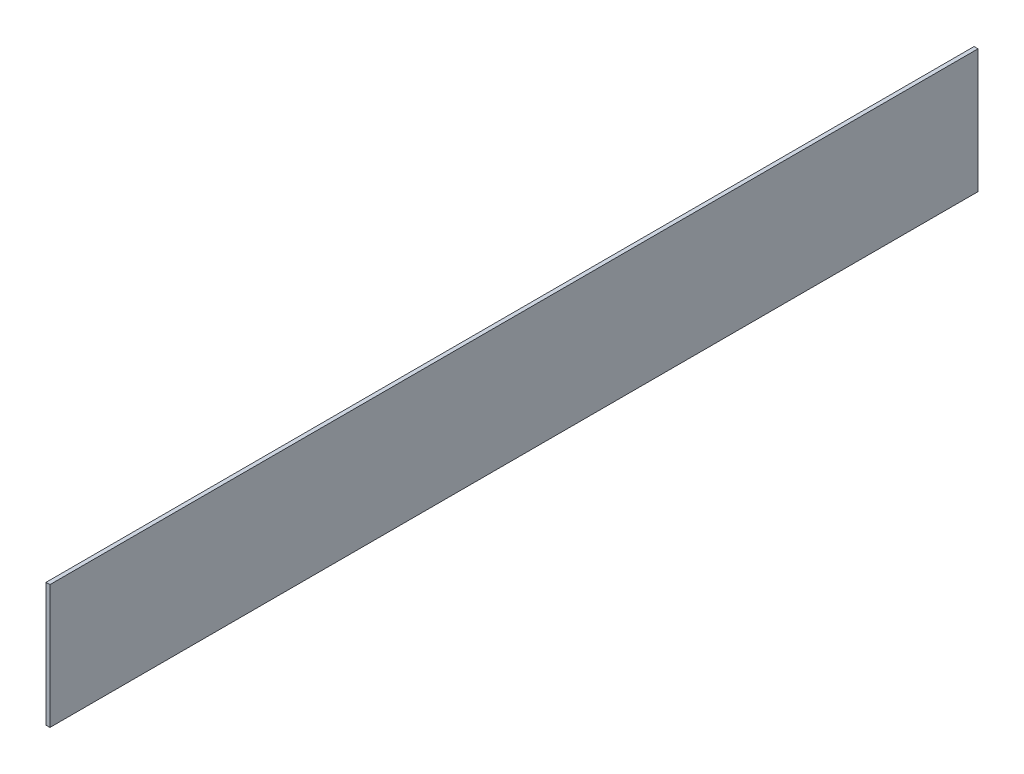
ISO-10303-21;
HEADER;
FILE_DESCRIPTION(('STEP AP214'),'2;1');
FILE_NAME('part.step','',(''),(''),'','','');
FILE_SCHEMA(('AUTOMOTIVE_DESIGN { 1 0 10303 214 1 1 1 1 }'));
ENDSEC;
DATA;
#1=APPLICATION_CONTEXT('core data for automotive mechanical design processes');
#2=APPLICATION_PROTOCOL_DEFINITION('international standard','automotive_design',2000,#1);
#3=PRODUCT_CONTEXT('',#1,'mechanical');
#4=PRODUCT('Part','Part','',(#3));
#5=PRODUCT_RELATED_PRODUCT_CATEGORY('part','',(#4));
#6=PRODUCT_DEFINITION_FORMATION('','',#4);
#7=PRODUCT_DEFINITION_CONTEXT('part definition',#1,'design');
#8=PRODUCT_DEFINITION('design','',#6,#7);
#9=PRODUCT_DEFINITION_SHAPE('','',#8);
#10=(LENGTH_UNIT() NAMED_UNIT(*) SI_UNIT(.MILLI.,.METRE.));
#11=(NAMED_UNIT(*) PLANE_ANGLE_UNIT() SI_UNIT($,.RADIAN.));
#12=(NAMED_UNIT(*) SI_UNIT($,.STERADIAN.) SOLID_ANGLE_UNIT());
#13=UNCERTAINTY_MEASURE_WITH_UNIT(LENGTH_MEASURE(1.E-05),#10,'distance_accuracy_value','');
#14=(GEOMETRIC_REPRESENTATION_CONTEXT(3) GLOBAL_UNCERTAINTY_ASSIGNED_CONTEXT((#13)) GLOBAL_UNIT_ASSIGNED_CONTEXT((#10,
#11,#12)) REPRESENTATION_CONTEXT('',''));
#15=CARTESIAN_POINT('',(0.,0.,0.));
#16=DIRECTION('',(0.,0.,1.));
#17=DIRECTION('',(1.,0.,0.));
#18=AXIS2_PLACEMENT_3D('',#15,#16,#17);
#19=CARTESIAN_POINT('',(3.175,100.,750.));
#20=DIRECTION('',(0.,0.,-1.));
#21=DIRECTION('',(-1.,0.,0.));
#22=AXIS2_PLACEMENT_3D('',#19,#20,#21);
#23=PLANE('',#22);
#24=DIRECTION('',(0.,-1.,0.));
#25=VECTOR('',#24,1.);
#26=CARTESIAN_POINT('',(-3.175,100.,750.));
#27=LINE('',#26,#25);
#28=CARTESIAN_POINT('',(-3.175,100.,750.));
#29=VERTEX_POINT('',#28);
#30=CARTESIAN_POINT('',(-3.175,-100.,750.));
#31=VERTEX_POINT('',#30);
#32=EDGE_CURVE('E96',#29,#31,#27,.T.);
#33=ORIENTED_EDGE('',*,*,#32,.T.);
#34=DIRECTION('',(-1.,0.,0.));
#35=VECTOR('',#34,1.);
#36=CARTESIAN_POINT('',(3.175,-100.,750.));
#37=LINE('',#36,#35);
#38=CARTESIAN_POINT('',(3.175,-100.,750.));
#39=VERTEX_POINT('',#38);
#40=EDGE_CURVE('E11',#39,#31,#37,.T.);
#41=ORIENTED_EDGE('',*,*,#40,.F.);
#42=DIRECTION('',(0.,-1.,0.));
#43=VECTOR('',#42,1.);
#44=CARTESIAN_POINT('',(3.175,100.,750.));
#45=LINE('',#44,#43);
#46=CARTESIAN_POINT('',(3.175,100.,750.));
#47=VERTEX_POINT('',#46);
#48=EDGE_CURVE('E84',#47,#39,#45,.T.);
#49=ORIENTED_EDGE('',*,*,#48,.F.);
#50=DIRECTION('',(-1.,0.,0.));
#51=VECTOR('',#50,1.);
#52=CARTESIAN_POINT('',(3.175,100.,750.));
#53=LINE('',#52,#51);
#54=EDGE_CURVE('E92',#47,#29,#53,.T.);
#55=ORIENTED_EDGE('',*,*,#54,.T.);
#56=EDGE_LOOP('',(#33,#41,#49,#55));
#57=FACE_BOUND('',#56,.T.);
#58=ADVANCED_FACE('F33',(#57),#23,.F.);
#59=CARTESIAN_POINT('',(3.175,-99.9999999999999,-750.));
#60=DIRECTION('',(0.,1.,0.));
#61=DIRECTION('',(0.,0.,1.));
#62=AXIS2_PLACEMENT_3D('',#59,#60,#61);
#63=PLANE('',#62);
#64=DIRECTION('',(0.,0.,-1.));
#65=VECTOR('',#64,1.);
#66=CARTESIAN_POINT('',(-3.175,-99.9999999999999,-750.));
#67=LINE('',#66,#65);
#68=CARTESIAN_POINT('',(-3.175,-99.9999999999999,-750.));
#69=VERTEX_POINT('',#68);
#70=EDGE_CURVE('E88',#31,#69,#67,.T.);
#71=ORIENTED_EDGE('',*,*,#70,.T.);
#72=DIRECTION('',(-1.,0.,0.));
#73=VECTOR('',#72,1.);
#74=CARTESIAN_POINT('',(3.175,-99.9999999999999,-750.));
#75=LINE('',#74,#73);
#76=CARTESIAN_POINT('',(3.175,-99.9999999999999,-750.));
#77=VERTEX_POINT('',#76);
#78=EDGE_CURVE('E41',#77,#69,#75,.T.);
#79=ORIENTED_EDGE('',*,*,#78,.F.);
#80=DIRECTION('',(0.,0.,-1.));
#81=VECTOR('',#80,1.);
#82=CARTESIAN_POINT('',(3.175,-99.9999999999999,-750.));
#83=LINE('',#82,#81);
#84=EDGE_CURVE('E79',#39,#77,#83,.T.);
#85=ORIENTED_EDGE('',*,*,#84,.F.);
#86=ORIENTED_EDGE('',*,*,#40,.T.);
#87=EDGE_LOOP('',(#71,#79,#85,#86));
#88=FACE_BOUND('',#87,.T.);
#89=ADVANCED_FACE('F87',(#88),#63,.F.);
#90=CARTESIAN_POINT('',(3.175,100.,-750.));
#91=DIRECTION('',(0.,0.,1.));
#92=DIRECTION('',(1.,0.,0.));
#93=AXIS2_PLACEMENT_3D('',#90,#91,#92);
#94=PLANE('',#93);
#95=DIRECTION('',(0.,1.,0.));
#96=VECTOR('',#95,1.);
#97=CARTESIAN_POINT('',(-3.175,100.,-750.));
#98=LINE('',#97,#96);
#99=CARTESIAN_POINT('',(-3.175,100.,-750.));
#100=VERTEX_POINT('',#99);
#101=EDGE_CURVE('E66',#69,#100,#98,.T.);
#102=ORIENTED_EDGE('',*,*,#101,.T.);
#103=DIRECTION('',(-1.,0.,0.));
#104=VECTOR('',#103,1.);
#105=CARTESIAN_POINT('',(3.175,100.,-750.));
#106=LINE('',#105,#104);
#107=CARTESIAN_POINT('',(3.175,100.,-750.));
#108=VERTEX_POINT('',#107);
#109=EDGE_CURVE('E89',#108,#100,#106,.T.);
#110=ORIENTED_EDGE('',*,*,#109,.F.);
#111=DIRECTION('',(0.,1.,0.));
#112=VECTOR('',#111,1.);
#113=CARTESIAN_POINT('',(3.175,100.,-750.));
#114=LINE('',#113,#112);
#115=EDGE_CURVE('E82',#77,#108,#114,.T.);
#116=ORIENTED_EDGE('',*,*,#115,.F.);
#117=ORIENTED_EDGE('',*,*,#78,.T.);
#118=EDGE_LOOP('',(#102,#110,#116,#117));
#119=FACE_BOUND('',#118,.T.);
#120=ADVANCED_FACE('F90',(#119),#94,.F.);
#121=CARTESIAN_POINT('',(3.175,100.,-750.));
#122=DIRECTION('',(0.,-1.,0.));
#123=DIRECTION('',(0.,0.,-1.));
#124=AXIS2_PLACEMENT_3D('',#121,#122,#123);
#125=PLANE('',#124);
#126=DIRECTION('',(0.,0.,1.));
#127=VECTOR('',#126,1.);
#128=CARTESIAN_POINT('',(-3.175,100.,-750.));
#129=LINE('',#128,#127);
#130=EDGE_CURVE('E72',#100,#29,#129,.T.);
#131=ORIENTED_EDGE('',*,*,#130,.T.);
#132=ORIENTED_EDGE('',*,*,#54,.F.);
#133=DIRECTION('',(0.,0.,1.));
#134=VECTOR('',#133,1.);
#135=CARTESIAN_POINT('',(3.175,100.,-750.));
#136=LINE('',#135,#134);
#137=EDGE_CURVE('E49',#108,#47,#136,.T.);
#138=ORIENTED_EDGE('',*,*,#137,.F.);
#139=ORIENTED_EDGE('',*,*,#109,.T.);
#140=EDGE_LOOP('',(#131,#132,#138,#139));
#141=FACE_BOUND('',#140,.T.);
#142=ADVANCED_FACE('F103',(#141),#125,.F.);
#143=CARTESIAN_POINT('',(3.175,0.,0.));
#144=DIRECTION('',(-1.,0.,0.));
#145=DIRECTION('',(0.,0.,1.));
#146=AXIS2_PLACEMENT_3D('',#143,#144,#145);
#147=PLANE('',#146);
#148=ORIENTED_EDGE('',*,*,#48,.T.);
#149=ORIENTED_EDGE('',*,*,#84,.T.);
#150=ORIENTED_EDGE('',*,*,#115,.T.);
#151=ORIENTED_EDGE('',*,*,#137,.T.);
#152=EDGE_LOOP('',(#148,#149,#150,#151));
#153=FACE_BOUND('',#152,.T.);
#154=ADVANCED_FACE('F80',(#153),#147,.F.);
#155=CARTESIAN_POINT('',(-3.175,0.,0.));
#156=DIRECTION('',(-1.,0.,0.));
#157=DIRECTION('',(0.,0.,1.));
#158=AXIS2_PLACEMENT_3D('',#155,#156,#157);
#159=PLANE('',#158);
#160=ORIENTED_EDGE('',*,*,#32,.F.);
#161=ORIENTED_EDGE('',*,*,#130,.F.);
#162=ORIENTED_EDGE('',*,*,#101,.F.);
#163=ORIENTED_EDGE('',*,*,#70,.F.);
#164=EDGE_LOOP('',(#160,#161,#162,#163));
#165=FACE_BOUND('',#164,.T.);
#166=ADVANCED_FACE('F106',(#165),#159,.T.);
#167=CLOSED_SHELL('',(#58,#89,#120,#142,#154,#166));
#168=MANIFOLD_SOLID_BREP('B2',#167);
#169=ADVANCED_BREP_SHAPE_REPRESENTATION('',(#18,#168),#14);
#170=SHAPE_DEFINITION_REPRESENTATION(#9,#169);
ENDSEC;
END-ISO-10303-21;
